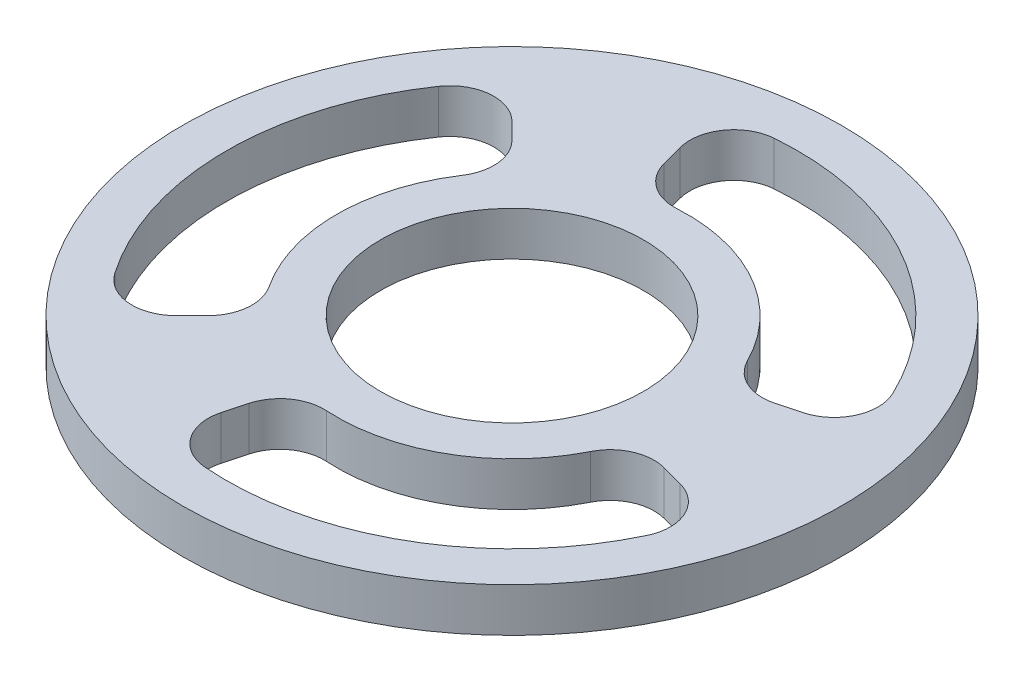
ISO-10303-21;
HEADER;
FILE_DESCRIPTION(('STEP AP214'),'2;1');
FILE_NAME('part.step','',(''),(''),'','','');
FILE_SCHEMA(('AUTOMOTIVE_DESIGN { 1 0 10303 214 1 1 1 1 }'));
ENDSEC;
DATA;
#1=APPLICATION_CONTEXT('core data for automotive mechanical design processes');
#2=APPLICATION_PROTOCOL_DEFINITION('international standard','automotive_design',2000,#1);
#3=PRODUCT_CONTEXT('',#1,'mechanical');
#4=PRODUCT('Part','Part','',(#3));
#5=PRODUCT_RELATED_PRODUCT_CATEGORY('part','',(#4));
#6=PRODUCT_DEFINITION_FORMATION('','',#4);
#7=PRODUCT_DEFINITION_CONTEXT('part definition',#1,'design');
#8=PRODUCT_DEFINITION('design','',#6,#7);
#9=PRODUCT_DEFINITION_SHAPE('','',#8);
#10=(LENGTH_UNIT() NAMED_UNIT(*) SI_UNIT(.MILLI.,.METRE.));
#11=(NAMED_UNIT(*) PLANE_ANGLE_UNIT() SI_UNIT($,.RADIAN.));
#12=(NAMED_UNIT(*) SI_UNIT($,.STERADIAN.) SOLID_ANGLE_UNIT());
#13=UNCERTAINTY_MEASURE_WITH_UNIT(LENGTH_MEASURE(1.E-05),#10,'distance_accuracy_value','');
#14=(GEOMETRIC_REPRESENTATION_CONTEXT(3) GLOBAL_UNCERTAINTY_ASSIGNED_CONTEXT((#13)) GLOBAL_UNIT_ASSIGNED_CONTEXT((#10,
#11,#12)) REPRESENTATION_CONTEXT('',''));
#15=CARTESIAN_POINT('',(0.,0.,0.));
#16=DIRECTION('',(0.,0.,1.));
#17=DIRECTION('',(1.,0.,0.));
#18=AXIS2_PLACEMENT_3D('',#15,#16,#17);
#19=CARTESIAN_POINT('',(0.,6.35,0.));
#20=DIRECTION('',(0.,1.,0.));
#21=DIRECTION('',(0.,0.,1.));
#22=AXIS2_PLACEMENT_3D('',#19,#20,#21);
#23=PLANE('',#22);
#24=DIRECTION('',(0.707106781186543,0.,-0.707106781186552));
#25=VECTOR('',#24,1.);
#26=CARTESIAN_POINT('',(-17.9251569030789,6.35,17.9251569030791));
#27=LINE('',#26,#25);
#28=CARTESIAN_POINT('',(-24.2840804334855,6.35,24.2840804334858));
#29=VERTEX_POINT('',#28);
#30=CARTESIAN_POINT('',(-21.9609596784839,6.35,21.9609596784841));
#31=VERTEX_POINT('',#30);
#32=EDGE_CURVE('E269',#29,#31,#27,.T.);
#33=ORIENTED_EDGE('',*,*,#32,.F.);
#34=CARTESIAN_POINT('',(-28.7742084940201,6.35,19.7939523729512));
#35=DIRECTION('',(0.,1.,0.));
#36=DIRECTION('',(0.866025403784436,0.,-0.500000000000004));
#37=AXIS2_PLACEMENT_3D('',#34,#35,#36);
#38=CIRCLE('',#37,6.35);
#39=CARTESIAN_POINT('',(-34.0058827656601,6.35,23.3928528043969));
#40=VERTEX_POINT('',#39);
#41=EDGE_CURVE('E215',#29,#40,#38,.F.);
#42=ORIENTED_EDGE('',*,*,#41,.T.);
#43=CARTESIAN_POINT('',(0.,6.35,0.));
#44=DIRECTION('',(0.,1.,0.));
#45=DIRECTION('',(0.866025403784436,0.,-0.500000000000004));
#46=AXIS2_PLACEMENT_3D('',#43,#44,#45);
#47=CIRCLE('',#46,41.275);
#48=CARTESIAN_POINT('',(-34.0058827656604,6.35,-23.3928528043965));
#49=VERTEX_POINT('',#48);
#50=EDGE_CURVE('E57',#49,#40,#47,.T.);
#51=ORIENTED_EDGE('',*,*,#50,.F.);
#52=CARTESIAN_POINT('',(-28.7742084940203,6.35,-19.7939523729509));
#53=DIRECTION('',(0.,1.,0.));
#54=DIRECTION('',(0.866025403784436,0.,-0.500000000000004));
#55=AXIS2_PLACEMENT_3D('',#52,#53,#54);
#56=CIRCLE('',#55,6.35);
#57=CARTESIAN_POINT('',(-24.2840804334858,6.35,-24.2840804334855));
#58=VERTEX_POINT('',#57);
#59=EDGE_CURVE('E234',#49,#58,#56,.F.);
#60=ORIENTED_EDGE('',*,*,#59,.T.);
#61=DIRECTION('',(-0.707106781186551,0.,-0.707106781186544));
#62=VECTOR('',#61,1.);
#63=CARTESIAN_POINT('',(-17.9251569030791,6.35,-17.9251569030789));
#64=LINE('',#63,#62);
#65=CARTESIAN_POINT('',(-21.9609596784841,6.35,-21.9609596784839));
#66=VERTEX_POINT('',#65);
#67=EDGE_CURVE('E243',#66,#58,#64,.T.);
#68=ORIENTED_EDGE('',*,*,#67,.F.);
#69=CARTESIAN_POINT('',(-26.4510877390187,6.35,-17.4708316179493));
#70=DIRECTION('',(0.,1.,0.));
#71=DIRECTION('',(0.866025403784436,0.,-0.500000000000004));
#72=AXIS2_PLACEMENT_3D('',#69,#70,#71);
#73=CIRCLE('',#72,6.35);
#74=CARTESIAN_POINT('',(-21.1525259994992,6.35,-13.9711539910099));
#75=VERTEX_POINT('',#74);
#76=EDGE_CURVE('E249',#66,#75,#73,.F.);
#77=ORIENTED_EDGE('',*,*,#76,.T.);
#78=CARTESIAN_POINT('',(0.,6.35,0.));
#79=DIRECTION('',(0.,-1.,0.));
#80=DIRECTION('',(0.866025403784436,0.,-0.500000000000004));
#81=AXIS2_PLACEMENT_3D('',#78,#79,#80);
#82=CIRCLE('',#81,25.35);
#83=CARTESIAN_POINT('',(-21.152525999499,6.35,13.9711539910101));
#84=VERTEX_POINT('',#83);
#85=EDGE_CURVE('E251',#84,#75,#82,.T.);
#86=ORIENTED_EDGE('',*,*,#85,.F.);
#87=CARTESIAN_POINT('',(-26.4510877390185,6.35,17.4708316179496));
#88=DIRECTION('',(0.,1.,0.));
#89=DIRECTION('',(0.866025403784436,0.,-0.500000000000004));
#90=AXIS2_PLACEMENT_3D('',#87,#88,#89);
#91=CIRCLE('',#90,6.35);
#92=EDGE_CURVE('E270',#84,#31,#91,.F.);
#93=ORIENTED_EDGE('',*,*,#92,.T.);
#94=EDGE_LOOP('',(#33,#42,#51,#60,#68,#77,#86,#93));
#95=FACE_BOUND('',#94,.T.);
#96=DIRECTION('',(-0.965925826289071,0.,-0.258819045102511));
#97=VECTOR('',#96,1.);
#98=CARTESIAN_POINT('',(24.4862196964279,6.35,6.56106279334865));
#99=LINE('',#98,#97);
#100=CARTESIAN_POINT('',(33.1726707796861,6.35,8.88859034620002));
#101=VERTEX_POINT('',#100);
#102=CARTESIAN_POINT('',(29.999228812295,6.35,8.03826913381057));
#103=VERTEX_POINT('',#102);
#104=EDGE_CURVE('E338',#101,#103,#99,.T.);
#105=ORIENTED_EDGE('',*,*,#104,.F.);
#106=CARTESIAN_POINT('',(31.5291698432851,6.35,15.0222193431356));
#107=DIRECTION('',(0.,1.,0.));
#108=DIRECTION('',(-0.866025403784443,0.,-0.499999999999992));
#109=AXIS2_PLACEMENT_3D('',#106,#107,#108);
#110=CIRCLE('',#109,6.35);
#111=CARTESIAN_POINT('',(37.2617461784279,6.35,17.7535319509785));
#112=VERTEX_POINT('',#111);
#113=EDGE_CURVE('E276',#101,#112,#110,.F.);
#114=ORIENTED_EDGE('',*,*,#113,.T.);
#115=CARTESIAN_POINT('',(0.,6.35,0.));
#116=DIRECTION('',(0.,1.,0.));
#117=DIRECTION('',(-0.866025403784443,0.,-0.499999999999992));
#118=AXIS2_PLACEMENT_3D('',#115,#116,#117);
#119=CIRCLE('',#118,41.275);
#120=CARTESIAN_POINT('',(-3.25586341276705,6.35,41.1463847553756));
#121=VERTEX_POINT('',#120);
#122=EDGE_CURVE('E64',#121,#112,#119,.T.);
#123=ORIENTED_EDGE('',*,*,#122,.F.);
#124=CARTESIAN_POINT('',(-2.75496134926442,6.35,34.816171716087));
#125=DIRECTION('',(0.,1.,0.));
#126=DIRECTION('',(-0.866025403784443,0.,-0.499999999999992));
#127=AXIS2_PLACEMENT_3D('',#124,#125,#126);
#128=CIRCLE('',#127,6.35);
#129=CARTESIAN_POINT('',(-8.88859034620003,6.35,33.1726707796861));
#130=VERTEX_POINT('',#129);
#131=EDGE_CURVE('E299',#121,#130,#128,.F.);
#132=ORIENTED_EDGE('',*,*,#131,.T.);
#133=DIRECTION('',(-0.258819045102511,0.,0.965925826289071));
#134=VECTOR('',#133,1.);
#135=CARTESIAN_POINT('',(-6.56106279334865,6.35,24.4862196964279));
#136=LINE('',#135,#134);
#137=CARTESIAN_POINT('',(-8.03826913381057,6.35,29.999228812295));
#138=VERTEX_POINT('',#137);
#139=EDGE_CURVE('E307',#138,#130,#136,.T.);
#140=ORIENTED_EDGE('',*,*,#139,.F.);
#141=CARTESIAN_POINT('',(-1.90464013687497,6.35,31.6427297486959));
#142=DIRECTION('',(0.,1.,0.));
#143=DIRECTION('',(-0.866025403784443,0.,-0.499999999999992));
#144=AXIS2_PLACEMENT_3D('',#141,#142,#143);
#145=CIRCLE('',#144,6.35);
#146=CARTESIAN_POINT('',(-1.52311127664923,6.35,25.3042018652821));
#147=VERTEX_POINT('',#146);
#148=EDGE_CURVE('E316',#138,#147,#145,.F.);
#149=ORIENTED_EDGE('',*,*,#148,.T.);
#150=CARTESIAN_POINT('',(0.,6.35,0.));
#151=DIRECTION('',(0.,-1.,0.));
#152=DIRECTION('',(-0.866025403784443,0.,-0.499999999999992));
#153=AXIS2_PLACEMENT_3D('',#150,#151,#152);
#154=CIRCLE('',#153,25.35);
#155=CARTESIAN_POINT('',(22.6756372761487,6.35,11.3330478742718));
#156=VERTEX_POINT('',#155);
#157=EDGE_CURVE('E317',#156,#147,#154,.T.);
#158=ORIENTED_EDGE('',*,*,#157,.F.);
#159=CARTESIAN_POINT('',(28.355727875894,6.35,14.1718981307462));
#160=DIRECTION('',(0.,1.,0.));
#161=DIRECTION('',(-0.866025403784443,0.,-0.499999999999992));
#162=AXIS2_PLACEMENT_3D('',#159,#160,#161);
#163=CIRCLE('',#162,6.35);
#164=EDGE_CURVE('E334',#156,#103,#163,.F.);
#165=ORIENTED_EDGE('',*,*,#164,.T.);
#166=EDGE_LOOP('',(#105,#114,#123,#132,#140,#149,#158,#165));
#167=FACE_BOUND('',#166,.T.);
#168=CARTESIAN_POINT('',(0.,6.35,0.));
#169=DIRECTION('',(0.,-1.,0.));
#170=DIRECTION('',(0.,0.,1.));
#171=AXIS2_PLACEMENT_3D('',#168,#169,#170);
#172=CIRCLE('',#171,25.35);
#173=CARTESIAN_POINT('',(-1.52311127664951,6.35,-25.304201865282));
#174=VERTEX_POINT('',#173);
#175=CARTESIAN_POINT('',(22.6756372761486,6.35,-11.333047874272));
#176=VERTEX_POINT('',#175);
#177=EDGE_CURVE('E274',#174,#176,#172,.T.);
#178=ORIENTED_EDGE('',*,*,#177,.F.);
#179=CARTESIAN_POINT('',(-1.90464013687533,6.35,-31.6427297486959));
#180=DIRECTION('',(0.,1.,0.));
#181=DIRECTION('',(0.,0.,1.));
#182=AXIS2_PLACEMENT_3D('',#179,#180,#181);
#183=CIRCLE('',#182,6.35);
#184=CARTESIAN_POINT('',(-8.03826913381091,6.35,-29.9992288122949));
#185=VERTEX_POINT('',#184);
#186=EDGE_CURVE('E396',#174,#185,#183,.F.);
#187=ORIENTED_EDGE('',*,*,#186,.T.);
#188=DIRECTION('',(0.258819045102522,0.,0.965925826289068));
#189=VECTOR('',#188,1.);
#190=CARTESIAN_POINT('',(-6.56106279334892,6.35,-24.4862196964279));
#191=LINE('',#190,#189);
#192=CARTESIAN_POINT('',(-8.8885903462004,6.35,-33.172670779686));
#193=VERTEX_POINT('',#192);
#194=EDGE_CURVE('E341',#193,#185,#191,.T.);
#195=ORIENTED_EDGE('',*,*,#194,.F.);
#196=CARTESIAN_POINT('',(-2.75496134926482,6.35,-34.816171716087));
#197=DIRECTION('',(0.,1.,0.));
#198=DIRECTION('',(0.,0.,1.));
#199=AXIS2_PLACEMENT_3D('',#196,#197,#198);
#200=CIRCLE('',#199,6.35);
#201=CARTESIAN_POINT('',(-3.25586341276751,6.35,-41.1463847553756));
#202=VERTEX_POINT('',#201);
#203=EDGE_CURVE('E47',#193,#202,#200,.F.);
#204=ORIENTED_EDGE('',*,*,#203,.T.);
#205=CARTESIAN_POINT('',(0.,6.35,0.));
#206=DIRECTION('',(0.,1.,0.));
#207=DIRECTION('',(0.,0.,1.));
#208=AXIS2_PLACEMENT_3D('',#205,#206,#207);
#209=CIRCLE('',#208,41.275);
#210=CARTESIAN_POINT('',(37.2617461784277,6.35,-17.7535319509789));
#211=VERTEX_POINT('',#210);
#212=EDGE_CURVE('E359',#211,#202,#209,.T.);
#213=ORIENTED_EDGE('',*,*,#212,.F.);
#214=CARTESIAN_POINT('',(31.529169843285,6.35,-15.022219343136));
#215=DIRECTION('',(0.,1.,0.));
#216=DIRECTION('',(0.,0.,1.));
#217=AXIS2_PLACEMENT_3D('',#214,#215,#216);
#218=CIRCLE('',#217,6.35);
#219=CARTESIAN_POINT('',(33.172670779686,6.35,-8.8885903462004));
#220=VERTEX_POINT('',#219);
#221=EDGE_CURVE('E404',#211,#220,#218,.F.);
#222=ORIENTED_EDGE('',*,*,#221,.T.);
#223=DIRECTION('',(0.965925826289068,0.,-0.258819045102521));
#224=VECTOR('',#223,1.);
#225=CARTESIAN_POINT('',(24.4862196964279,6.35,-6.56106279334893));
#226=LINE('',#225,#224);
#227=CARTESIAN_POINT('',(29.9992288122949,6.35,-8.03826913381091));
#228=VERTEX_POINT('',#227);
#229=EDGE_CURVE('E360',#228,#220,#226,.T.);
#230=ORIENTED_EDGE('',*,*,#229,.F.);
#231=CARTESIAN_POINT('',(28.3557278758939,6.35,-14.1718981307465));
#232=DIRECTION('',(0.,1.,0.));
#233=DIRECTION('',(0.,0.,1.));
#234=AXIS2_PLACEMENT_3D('',#231,#232,#233);
#235=CIRCLE('',#234,6.35);
#236=EDGE_CURVE('E397',#228,#176,#235,.F.);
#237=ORIENTED_EDGE('',*,*,#236,.T.);
#238=EDGE_LOOP('',(#178,#187,#195,#204,#213,#222,#230,#237));
#239=FACE_BOUND('',#238,.T.);
#240=CARTESIAN_POINT('',(0.,6.35,0.));
#241=DIRECTION('',(0.,1.,0.));
#242=DIRECTION('',(0.,0.,1.));
#243=AXIS2_PLACEMENT_3D('',#240,#241,#242);
#244=CIRCLE('',#243,47.625);
#245=CARTESIAN_POINT('',(0.,6.35,47.625));
#246=VERTEX_POINT('',#245);
#247=EDGE_CURVE('E371',#246,#246,#244,.T.);
#248=ORIENTED_EDGE('',*,*,#247,.T.);
#249=EDGE_LOOP('',(#248));
#250=FACE_BOUND('',#249,.T.);
#251=CARTESIAN_POINT('',(0.,6.35,0.));
#252=DIRECTION('',(0.,1.,0.));
#253=DIRECTION('',(0.,0.,1.));
#254=AXIS2_PLACEMENT_3D('',#251,#252,#253);
#255=CIRCLE('',#254,19.);
#256=CARTESIAN_POINT('',(0.,6.35,19.));
#257=VERTEX_POINT('',#256);
#258=EDGE_CURVE('E364',#257,#257,#255,.T.);
#259=ORIENTED_EDGE('',*,*,#258,.F.);
#260=EDGE_LOOP('',(#259));
#261=FACE_BOUND('',#260,.T.);
#262=ADVANCED_FACE('F41',(#95,#167,#239,#250,#261),#23,.T.);
#263=CARTESIAN_POINT('',(0.,0.,0.));
#264=DIRECTION('',(0.,1.,0.));
#265=DIRECTION('',(0.,0.,1.));
#266=AXIS2_PLACEMENT_3D('',#263,#264,#265);
#267=PLANE('',#266);
#268=CARTESIAN_POINT('',(-28.7742084940201,0.,19.7939523729512));
#269=DIRECTION('',(0.,1.,0.));
#270=DIRECTION('',(0.866025403784436,0.,-0.500000000000004));
#271=AXIS2_PLACEMENT_3D('',#268,#269,#270);
#272=CIRCLE('',#271,6.35);
#273=CARTESIAN_POINT('',(-34.0058827656601,0.,23.3928528043969));
#274=VERTEX_POINT('',#273);
#275=CARTESIAN_POINT('',(-24.2840804334855,0.,24.2840804334858));
#276=VERTEX_POINT('',#275);
#277=EDGE_CURVE('E201',#274,#276,#272,.T.);
#278=ORIENTED_EDGE('',*,*,#277,.T.);
#279=DIRECTION('',(0.707106781186543,0.,-0.707106781186552));
#280=VECTOR('',#279,1.);
#281=CARTESIAN_POINT('',(-17.9251569030789,0.,17.9251569030791));
#282=LINE('',#281,#280);
#283=CARTESIAN_POINT('',(-21.9609596784839,0.,21.9609596784841));
#284=VERTEX_POINT('',#283);
#285=EDGE_CURVE('E272',#276,#284,#282,.T.);
#286=ORIENTED_EDGE('',*,*,#285,.T.);
#287=CARTESIAN_POINT('',(-26.4510877390185,0.,17.4708316179496));
#288=DIRECTION('',(0.,1.,0.));
#289=DIRECTION('',(0.866025403784436,0.,-0.500000000000004));
#290=AXIS2_PLACEMENT_3D('',#287,#288,#289);
#291=CIRCLE('',#290,6.35);
#292=CARTESIAN_POINT('',(-21.152525999499,0.,13.9711539910101));
#293=VERTEX_POINT('',#292);
#294=EDGE_CURVE('E261',#284,#293,#291,.T.);
#295=ORIENTED_EDGE('',*,*,#294,.T.);
#296=CARTESIAN_POINT('',(0.,0.,0.));
#297=DIRECTION('',(0.,-1.,0.));
#298=DIRECTION('',(0.866025403784436,0.,-0.500000000000004));
#299=AXIS2_PLACEMENT_3D('',#296,#297,#298);
#300=CIRCLE('',#299,25.35);
#301=CARTESIAN_POINT('',(-21.1525259994992,0.,-13.9711539910099));
#302=VERTEX_POINT('',#301);
#303=EDGE_CURVE('E258',#293,#302,#300,.T.);
#304=ORIENTED_EDGE('',*,*,#303,.T.);
#305=CARTESIAN_POINT('',(-26.4510877390187,0.,-17.4708316179493));
#306=DIRECTION('',(0.,1.,0.));
#307=DIRECTION('',(0.866025403784436,0.,-0.500000000000004));
#308=AXIS2_PLACEMENT_3D('',#305,#306,#307);
#309=CIRCLE('',#308,6.35);
#310=CARTESIAN_POINT('',(-21.9609596784841,0.,-21.9609596784839));
#311=VERTEX_POINT('',#310);
#312=EDGE_CURVE('E244',#302,#311,#309,.T.);
#313=ORIENTED_EDGE('',*,*,#312,.T.);
#314=DIRECTION('',(-0.707106781186551,0.,-0.707106781186544));
#315=VECTOR('',#314,1.);
#316=CARTESIAN_POINT('',(-17.9251569030791,0.,-17.9251569030789));
#317=LINE('',#316,#315);
#318=CARTESIAN_POINT('',(-24.2840804334858,0.,-24.2840804334855));
#319=VERTEX_POINT('',#318);
#320=EDGE_CURVE('E240',#311,#319,#317,.T.);
#321=ORIENTED_EDGE('',*,*,#320,.T.);
#322=CARTESIAN_POINT('',(-28.7742084940203,0.,-19.7939523729509));
#323=DIRECTION('',(0.,1.,0.));
#324=DIRECTION('',(0.866025403784436,0.,-0.500000000000004));
#325=AXIS2_PLACEMENT_3D('',#322,#323,#324);
#326=CIRCLE('',#325,6.35);
#327=CARTESIAN_POINT('',(-34.0058827656604,0.,-23.3928528043965));
#328=VERTEX_POINT('',#327);
#329=EDGE_CURVE('E224',#319,#328,#326,.T.);
#330=ORIENTED_EDGE('',*,*,#329,.T.);
#331=CARTESIAN_POINT('',(0.,0.,0.));
#332=DIRECTION('',(0.,1.,0.));
#333=DIRECTION('',(0.866025403784436,0.,-0.500000000000004));
#334=AXIS2_PLACEMENT_3D('',#331,#332,#333);
#335=CIRCLE('',#334,41.275);
#336=EDGE_CURVE('E216',#328,#274,#335,.T.);
#337=ORIENTED_EDGE('',*,*,#336,.T.);
#338=EDGE_LOOP('',(#278,#286,#295,#304,#313,#321,#330,#337));
#339=FACE_BOUND('',#338,.T.);
#340=CARTESIAN_POINT('',(31.5291698432851,0.,15.0222193431356));
#341=DIRECTION('',(0.,1.,0.));
#342=DIRECTION('',(-0.866025403784443,0.,-0.499999999999992));
#343=AXIS2_PLACEMENT_3D('',#340,#341,#342);
#344=CIRCLE('',#343,6.35);
#345=CARTESIAN_POINT('',(37.2617461784279,0.,17.7535319509785));
#346=VERTEX_POINT('',#345);
#347=CARTESIAN_POINT('',(33.1726707796861,0.,8.88859034620002));
#348=VERTEX_POINT('',#347);
#349=EDGE_CURVE('E277',#346,#348,#344,.T.);
#350=ORIENTED_EDGE('',*,*,#349,.T.);
#351=DIRECTION('',(-0.965925826289071,0.,-0.258819045102511));
#352=VECTOR('',#351,1.);
#353=CARTESIAN_POINT('',(24.4862196964279,0.,6.56106279334865));
#354=LINE('',#353,#352);
#355=CARTESIAN_POINT('',(29.999228812295,0.,8.03826913381057));
#356=VERTEX_POINT('',#355);
#357=EDGE_CURVE('E213',#348,#356,#354,.T.);
#358=ORIENTED_EDGE('',*,*,#357,.T.);
#359=CARTESIAN_POINT('',(28.355727875894,0.,14.1718981307462));
#360=DIRECTION('',(0.,1.,0.));
#361=DIRECTION('',(-0.866025403784443,0.,-0.499999999999992));
#362=AXIS2_PLACEMENT_3D('',#359,#360,#361);
#363=CIRCLE('',#362,6.35);
#364=CARTESIAN_POINT('',(22.6756372761487,0.,11.3330478742718));
#365=VERTEX_POINT('',#364);
#366=EDGE_CURVE('E330',#356,#365,#363,.T.);
#367=ORIENTED_EDGE('',*,*,#366,.T.);
#368=CARTESIAN_POINT('',(0.,0.,0.));
#369=DIRECTION('',(0.,-1.,0.));
#370=DIRECTION('',(-0.866025403784443,0.,-0.499999999999992));
#371=AXIS2_PLACEMENT_3D('',#368,#369,#370);
#372=CIRCLE('',#371,25.35);
#373=CARTESIAN_POINT('',(-1.52311127664923,0.,25.3042018652821));
#374=VERTEX_POINT('',#373);
#375=EDGE_CURVE('E325',#365,#374,#372,.T.);
#376=ORIENTED_EDGE('',*,*,#375,.T.);
#377=CARTESIAN_POINT('',(-1.90464013687497,0.,31.6427297486959));
#378=DIRECTION('',(0.,1.,0.));
#379=DIRECTION('',(-0.866025403784443,0.,-0.499999999999992));
#380=AXIS2_PLACEMENT_3D('',#377,#378,#379);
#381=CIRCLE('',#380,6.35);
#382=CARTESIAN_POINT('',(-8.03826913381057,0.,29.999228812295));
#383=VERTEX_POINT('',#382);
#384=EDGE_CURVE('E309',#374,#383,#381,.T.);
#385=ORIENTED_EDGE('',*,*,#384,.T.);
#386=DIRECTION('',(-0.258819045102511,0.,0.965925826289071));
#387=VECTOR('',#386,1.);
#388=CARTESIAN_POINT('',(-6.56106279334865,0.,24.4862196964279));
#389=LINE('',#388,#387);
#390=CARTESIAN_POINT('',(-8.88859034620003,0.,33.1726707796861));
#391=VERTEX_POINT('',#390);
#392=EDGE_CURVE('E305',#383,#391,#389,.T.);
#393=ORIENTED_EDGE('',*,*,#392,.T.);
#394=CARTESIAN_POINT('',(-2.75496134926442,0.,34.816171716087));
#395=DIRECTION('',(0.,1.,0.));
#396=DIRECTION('',(-0.866025403784443,0.,-0.499999999999992));
#397=AXIS2_PLACEMENT_3D('',#394,#395,#396);
#398=CIRCLE('',#397,6.35);
#399=CARTESIAN_POINT('',(-3.25586341276705,0.,41.1463847553756));
#400=VERTEX_POINT('',#399);
#401=EDGE_CURVE('E291',#391,#400,#398,.T.);
#402=ORIENTED_EDGE('',*,*,#401,.T.);
#403=CARTESIAN_POINT('',(0.,0.,0.));
#404=DIRECTION('',(0.,1.,0.));
#405=DIRECTION('',(-0.866025403784443,0.,-0.499999999999992));
#406=AXIS2_PLACEMENT_3D('',#403,#404,#405);
#407=CIRCLE('',#406,41.275);
#408=EDGE_CURVE('E290',#400,#346,#407,.T.);
#409=ORIENTED_EDGE('',*,*,#408,.T.);
#410=EDGE_LOOP('',(#350,#358,#367,#376,#385,#393,#402,#409));
#411=FACE_BOUND('',#410,.T.);
#412=CARTESIAN_POINT('',(0.,0.,0.));
#413=DIRECTION('',(0.,1.,0.));
#414=DIRECTION('',(0.,0.,1.));
#415=AXIS2_PLACEMENT_3D('',#412,#413,#414);
#416=CIRCLE('',#415,41.275);
#417=CARTESIAN_POINT('',(37.2617461784277,0.,-17.7535319509789));
#418=VERTEX_POINT('',#417);
#419=CARTESIAN_POINT('',(-3.25586341276751,0.,-41.1463847553756));
#420=VERTEX_POINT('',#419);
#421=EDGE_CURVE('E346',#418,#420,#416,.T.);
#422=ORIENTED_EDGE('',*,*,#421,.T.);
#423=CARTESIAN_POINT('',(-2.75496134926482,0.,-34.816171716087));
#424=DIRECTION('',(0.,1.,0.));
#425=DIRECTION('',(0.,0.,1.));
#426=AXIS2_PLACEMENT_3D('',#423,#424,#425);
#427=CIRCLE('',#426,6.35);
#428=CARTESIAN_POINT('',(-8.8885903462004,0.,-33.172670779686));
#429=VERTEX_POINT('',#428);
#430=EDGE_CURVE('E11',#420,#429,#427,.T.);
#431=ORIENTED_EDGE('',*,*,#430,.T.);
#432=DIRECTION('',(0.258819045102522,0.,0.965925826289068));
#433=VECTOR('',#432,1.);
#434=CARTESIAN_POINT('',(-6.56106279334892,0.,-24.4862196964279));
#435=LINE('',#434,#433);
#436=CARTESIAN_POINT('',(-8.03826913381091,0.,-29.9992288122949));
#437=VERTEX_POINT('',#436);
#438=EDGE_CURVE('E353',#429,#437,#435,.T.);
#439=ORIENTED_EDGE('',*,*,#438,.T.);
#440=CARTESIAN_POINT('',(-1.90464013687533,0.,-31.6427297486959));
#441=DIRECTION('',(0.,1.,0.));
#442=DIRECTION('',(0.,0.,1.));
#443=AXIS2_PLACEMENT_3D('',#440,#441,#442);
#444=CIRCLE('',#443,6.35);
#445=CARTESIAN_POINT('',(-1.52311127664951,0.,-25.304201865282));
#446=VERTEX_POINT('',#445);
#447=EDGE_CURVE('E405',#437,#446,#444,.T.);
#448=ORIENTED_EDGE('',*,*,#447,.T.);
#449=CARTESIAN_POINT('',(0.,0.,0.));
#450=DIRECTION('',(0.,-1.,0.));
#451=DIRECTION('',(0.,0.,1.));
#452=AXIS2_PLACEMENT_3D('',#449,#450,#451);
#453=CIRCLE('',#452,25.35);
#454=CARTESIAN_POINT('',(22.6756372761486,0.,-11.333047874272));
#455=VERTEX_POINT('',#454);
#456=EDGE_CURVE('E342',#446,#455,#453,.T.);
#457=ORIENTED_EDGE('',*,*,#456,.T.);
#458=CARTESIAN_POINT('',(28.3557278758939,0.,-14.1718981307465));
#459=DIRECTION('',(0.,1.,0.));
#460=DIRECTION('',(0.,0.,1.));
#461=AXIS2_PLACEMENT_3D('',#458,#459,#460);
#462=CIRCLE('',#461,6.35);
#463=CARTESIAN_POINT('',(29.9992288122949,0.,-8.03826913381091));
#464=VERTEX_POINT('',#463);
#465=EDGE_CURVE('E398',#455,#464,#462,.T.);
#466=ORIENTED_EDGE('',*,*,#465,.T.);
#467=DIRECTION('',(0.965925826289068,0.,-0.258819045102521));
#468=VECTOR('',#467,1.);
#469=CARTESIAN_POINT('',(24.4862196964279,0.,-6.56106279334893));
#470=LINE('',#469,#468);
#471=CARTESIAN_POINT('',(33.172670779686,0.,-8.8885903462004));
#472=VERTEX_POINT('',#471);
#473=EDGE_CURVE('E344',#464,#472,#470,.T.);
#474=ORIENTED_EDGE('',*,*,#473,.T.);
#475=CARTESIAN_POINT('',(31.529169843285,0.,-15.022219343136));
#476=DIRECTION('',(0.,1.,0.));
#477=DIRECTION('',(0.,0.,1.));
#478=AXIS2_PLACEMENT_3D('',#475,#476,#477);
#479=CIRCLE('',#478,6.35);
#480=EDGE_CURVE('E408',#472,#418,#479,.T.);
#481=ORIENTED_EDGE('',*,*,#480,.T.);
#482=EDGE_LOOP('',(#422,#431,#439,#448,#457,#466,#474,#481));
#483=FACE_BOUND('',#482,.T.);
#484=CARTESIAN_POINT('',(0.,0.,0.));
#485=DIRECTION('',(0.,1.,0.));
#486=DIRECTION('',(0.,0.,1.));
#487=AXIS2_PLACEMENT_3D('',#484,#485,#486);
#488=CIRCLE('',#487,47.625);
#489=CARTESIAN_POINT('',(0.,0.,47.625));
#490=VERTEX_POINT('',#489);
#491=EDGE_CURVE('E366',#490,#490,#488,.T.);
#492=ORIENTED_EDGE('',*,*,#491,.F.);
#493=EDGE_LOOP('',(#492));
#494=FACE_BOUND('',#493,.T.);
#495=CARTESIAN_POINT('',(0.,0.,0.));
#496=DIRECTION('',(0.,1.,0.));
#497=DIRECTION('',(0.,0.,1.));
#498=AXIS2_PLACEMENT_3D('',#495,#496,#497);
#499=CIRCLE('',#498,19.);
#500=CARTESIAN_POINT('',(0.,0.,19.));
#501=VERTEX_POINT('',#500);
#502=EDGE_CURVE('E354',#501,#501,#499,.T.);
#503=ORIENTED_EDGE('',*,*,#502,.T.);
#504=EDGE_LOOP('',(#503));
#505=FACE_BOUND('',#504,.T.);
#506=ADVANCED_FACE('F219',(#339,#411,#483,#494,#505),#267,.F.);
#507=CARTESIAN_POINT('',(0.,6.35,0.));
#508=DIRECTION('',(0.,-1.,0.));
#509=DIRECTION('',(0.,0.,-1.));
#510=AXIS2_PLACEMENT_3D('',#507,#508,#509);
#511=CYLINDRICAL_SURFACE('',#510,47.625);
#512=ORIENTED_EDGE('',*,*,#247,.F.);
#513=EDGE_LOOP('',(#512));
#514=FACE_BOUND('',#513,.T.);
#515=ORIENTED_EDGE('',*,*,#491,.T.);
#516=EDGE_LOOP('',(#515));
#517=FACE_BOUND('',#516,.T.);
#518=ADVANCED_FACE('F459',(#514,#517),#511,.T.);
#519=CARTESIAN_POINT('',(0.,6.35,0.));
#520=DIRECTION('',(0.,-1.,0.));
#521=DIRECTION('',(0.,0.,-1.));
#522=AXIS2_PLACEMENT_3D('',#519,#520,#521);
#523=CYLINDRICAL_SURFACE('',#522,19.);
#524=ORIENTED_EDGE('',*,*,#258,.T.);
#525=EDGE_LOOP('',(#524));
#526=FACE_BOUND('',#525,.T.);
#527=ORIENTED_EDGE('',*,*,#502,.F.);
#528=EDGE_LOOP('',(#527));
#529=FACE_BOUND('',#528,.T.);
#530=ADVANCED_FACE('F464',(#526,#529),#523,.F.);
#531=CARTESIAN_POINT('',(0.,0.,0.));
#532=DIRECTION('',(0.,1.,0.));
#533=DIRECTION('',(0.,0.,1.));
#534=AXIS2_PLACEMENT_3D('',#531,#532,#533);
#535=CYLINDRICAL_SURFACE('',#534,25.35);
#536=ORIENTED_EDGE('',*,*,#177,.T.);
#537=DIRECTION('',(0.,1.,0.));
#538=VECTOR('',#537,1.);
#539=CARTESIAN_POINT('',(22.6756372761486,0.,-11.333047874272));
#540=LINE('',#539,#538);
#541=EDGE_CURVE('E383',#176,#455,#540,.F.);
#542=ORIENTED_EDGE('',*,*,#541,.T.);
#543=ORIENTED_EDGE('',*,*,#456,.F.);
#544=DIRECTION('',(0.,1.,0.));
#545=VECTOR('',#544,1.);
#546=CARTESIAN_POINT('',(-1.52311127664951,0.,-25.304201865282));
#547=LINE('',#546,#545);
#548=EDGE_CURVE('E381',#446,#174,#547,.T.);
#549=ORIENTED_EDGE('',*,*,#548,.T.);
#550=EDGE_LOOP('',(#536,#542,#543,#549));
#551=FACE_BOUND('',#550,.T.);
#552=ADVANCED_FACE('F433',(#551),#535,.T.);
#553=CARTESIAN_POINT('',(-6.56106279334892,0.,-24.4862196964279));
#554=DIRECTION('',(-0.965925826289068,0.,0.258819045102522));
#555=DIRECTION('',(0.258819045102522,0.,0.965925826289068));
#556=AXIS2_PLACEMENT_3D('',#553,#554,#555);
#557=PLANE('',#556);
#558=ORIENTED_EDGE('',*,*,#194,.T.);
#559=DIRECTION('',(0.,-1.,0.));
#560=VECTOR('',#559,1.);
#561=CARTESIAN_POINT('',(-8.03826913381091,0.,-29.9992288122949));
#562=LINE('',#561,#560);
#563=EDGE_CURVE('E386',#185,#437,#562,.T.);
#564=ORIENTED_EDGE('',*,*,#563,.T.);
#565=ORIENTED_EDGE('',*,*,#438,.F.);
#566=DIRECTION('',(0.,-1.,0.));
#567=VECTOR('',#566,1.);
#568=CARTESIAN_POINT('',(-8.8885903462004,6.35,-33.172670779686));
#569=LINE('',#568,#567);
#570=EDGE_CURVE('E387',#429,#193,#569,.F.);
#571=ORIENTED_EDGE('',*,*,#570,.T.);
#572=EDGE_LOOP('',(#558,#564,#565,#571));
#573=FACE_BOUND('',#572,.T.);
#574=ADVANCED_FACE('F422',(#573),#557,.F.);
#575=CARTESIAN_POINT('',(0.,0.,0.));
#576=DIRECTION('',(0.,1.,0.));
#577=DIRECTION('',(0.,0.,1.));
#578=AXIS2_PLACEMENT_3D('',#575,#576,#577);
#579=CYLINDRICAL_SURFACE('',#578,41.275);
#580=ORIENTED_EDGE('',*,*,#421,.F.);
#581=DIRECTION('',(0.,1.,0.));
#582=VECTOR('',#581,1.);
#583=CARTESIAN_POINT('',(37.2617461784277,0.,-17.7535319509789));
#584=LINE('',#583,#582);
#585=EDGE_CURVE('E391',#418,#211,#584,.T.);
#586=ORIENTED_EDGE('',*,*,#585,.T.);
#587=ORIENTED_EDGE('',*,*,#212,.T.);
#588=DIRECTION('',(0.,1.,0.));
#589=VECTOR('',#588,1.);
#590=CARTESIAN_POINT('',(-3.25586341276751,0.,-41.1463847553756));
#591=LINE('',#590,#589);
#592=EDGE_CURVE('E393',#202,#420,#591,.F.);
#593=ORIENTED_EDGE('',*,*,#592,.T.);
#594=EDGE_LOOP('',(#580,#586,#587,#593));
#595=FACE_BOUND('',#594,.T.);
#596=ADVANCED_FACE('F417',(#595),#579,.F.);
#597=CARTESIAN_POINT('',(24.4862196964279,0.,-6.56106279334893));
#598=DIRECTION('',(0.258819045102522,0.,0.965925826289068));
#599=DIRECTION('',(0.965925826289068,0.,-0.258819045102522));
#600=AXIS2_PLACEMENT_3D('',#597,#598,#599);
#601=PLANE('',#600);
#602=ORIENTED_EDGE('',*,*,#473,.F.);
#603=DIRECTION('',(0.,-1.,0.));
#604=VECTOR('',#603,1.);
#605=CARTESIAN_POINT('',(29.9992288122949,6.35,-8.03826913381091));
#606=LINE('',#605,#604);
#607=EDGE_CURVE('E378',#464,#228,#606,.F.);
#608=ORIENTED_EDGE('',*,*,#607,.T.);
#609=ORIENTED_EDGE('',*,*,#229,.T.);
#610=DIRECTION('',(0.,-1.,0.));
#611=VECTOR('',#610,1.);
#612=CARTESIAN_POINT('',(33.172670779686,0.,-8.8885903462004));
#613=LINE('',#612,#611);
#614=EDGE_CURVE('E372',#220,#472,#613,.T.);
#615=ORIENTED_EDGE('',*,*,#614,.T.);
#616=EDGE_LOOP('',(#602,#608,#609,#615));
#617=FACE_BOUND('',#616,.T.);
#618=ADVANCED_FACE('F442',(#617),#601,.F.);
#619=CARTESIAN_POINT('',(28.3557278758939,0.,-14.1718981307465));
#620=DIRECTION('',(0.,1.,0.));
#621=DIRECTION('',(0.,0.,1.));
#622=AXIS2_PLACEMENT_3D('',#619,#620,#621);
#623=CYLINDRICAL_SURFACE('',#622,6.35);
#624=ORIENTED_EDGE('',*,*,#465,.F.);
#625=ORIENTED_EDGE('',*,*,#541,.F.);
#626=ORIENTED_EDGE('',*,*,#236,.F.);
#627=ORIENTED_EDGE('',*,*,#607,.F.);
#628=EDGE_LOOP('',(#624,#625,#626,#627));
#629=FACE_BOUND('',#628,.T.);
#630=ADVANCED_FACE('F436',(#629),#623,.F.);
#631=CARTESIAN_POINT('',(-1.90464013687533,0.,-31.6427297486959));
#632=DIRECTION('',(0.,1.,0.));
#633=DIRECTION('',(0.,0.,1.));
#634=AXIS2_PLACEMENT_3D('',#631,#632,#633);
#635=CYLINDRICAL_SURFACE('',#634,6.35);
#636=ORIENTED_EDGE('',*,*,#447,.F.);
#637=ORIENTED_EDGE('',*,*,#563,.F.);
#638=ORIENTED_EDGE('',*,*,#186,.F.);
#639=ORIENTED_EDGE('',*,*,#548,.F.);
#640=EDGE_LOOP('',(#636,#637,#638,#639));
#641=FACE_BOUND('',#640,.T.);
#642=ADVANCED_FACE('F428',(#641),#635,.F.);
#643=CARTESIAN_POINT('',(31.529169843285,0.,-15.022219343136));
#644=DIRECTION('',(0.,1.,0.));
#645=DIRECTION('',(0.,0.,1.));
#646=AXIS2_PLACEMENT_3D('',#643,#644,#645);
#647=CYLINDRICAL_SURFACE('',#646,6.35);
#648=ORIENTED_EDGE('',*,*,#480,.F.);
#649=ORIENTED_EDGE('',*,*,#614,.F.);
#650=ORIENTED_EDGE('',*,*,#221,.F.);
#651=ORIENTED_EDGE('',*,*,#585,.F.);
#652=EDGE_LOOP('',(#648,#649,#650,#651));
#653=FACE_BOUND('',#652,.T.);
#654=ADVANCED_FACE('F443',(#653),#647,.F.);
#655=CARTESIAN_POINT('',(-2.75496134926482,0.,-34.816171716087));
#656=DIRECTION('',(0.,1.,0.));
#657=DIRECTION('',(0.,0.,1.));
#658=AXIS2_PLACEMENT_3D('',#655,#656,#657);
#659=CYLINDRICAL_SURFACE('',#658,6.35);
#660=ORIENTED_EDGE('',*,*,#430,.F.);
#661=ORIENTED_EDGE('',*,*,#592,.F.);
#662=ORIENTED_EDGE('',*,*,#203,.F.);
#663=ORIENTED_EDGE('',*,*,#570,.F.);
#664=EDGE_LOOP('',(#660,#661,#662,#663));
#665=FACE_BOUND('',#664,.T.);
#666=ADVANCED_FACE('F43',(#665),#659,.F.);
#667=CARTESIAN_POINT('',(24.4862196964279,0.,6.56106279334865));
#668=DIRECTION('',(0.258819045102511,0.,-0.965925826289071));
#669=DIRECTION('',(-0.965925826289071,0.,-0.258819045102511));
#670=AXIS2_PLACEMENT_3D('',#667,#668,#669);
#671=PLANE('',#670);
#672=ORIENTED_EDGE('',*,*,#104,.T.);
#673=DIRECTION('',(0.,-1.,0.));
#674=VECTOR('',#673,1.);
#675=CARTESIAN_POINT('',(29.999228812295,0.,8.03826913381057));
#676=LINE('',#675,#674);
#677=EDGE_CURVE('E329',#103,#356,#676,.T.);
#678=ORIENTED_EDGE('',*,*,#677,.T.);
#679=ORIENTED_EDGE('',*,*,#357,.F.);
#680=DIRECTION('',(0.,-1.,0.));
#681=VECTOR('',#680,1.);
#682=CARTESIAN_POINT('',(33.1726707796861,6.35,8.88859034620003));
#683=LINE('',#682,#681);
#684=EDGE_CURVE('E284',#348,#101,#683,.F.);
#685=ORIENTED_EDGE('',*,*,#684,.T.);
#686=EDGE_LOOP('',(#672,#678,#679,#685));
#687=FACE_BOUND('',#686,.T.);
#688=ADVANCED_FACE('F452',(#687),#671,.F.);
#689=CARTESIAN_POINT('',(28.355727875894,0.,14.1718981307462));
#690=DIRECTION('',(0.,1.,0.));
#691=DIRECTION('',(-0.866025403784443,0.,-0.499999999999992));
#692=AXIS2_PLACEMENT_3D('',#689,#690,#691);
#693=CYLINDRICAL_SURFACE('',#692,6.35);
#694=ORIENTED_EDGE('',*,*,#366,.F.);
#695=ORIENTED_EDGE('',*,*,#677,.F.);
#696=ORIENTED_EDGE('',*,*,#164,.F.);
#697=DIRECTION('',(0.,1.,0.));
#698=VECTOR('',#697,1.);
#699=CARTESIAN_POINT('',(22.6756372761487,0.,11.3330478742718));
#700=LINE('',#699,#698);
#701=EDGE_CURVE('E324',#365,#156,#700,.T.);
#702=ORIENTED_EDGE('',*,*,#701,.F.);
#703=EDGE_LOOP('',(#694,#695,#696,#702));
#704=FACE_BOUND('',#703,.T.);
#705=ADVANCED_FACE('F518',(#704),#693,.F.);
#706=CARTESIAN_POINT('',(0.,0.,0.));
#707=DIRECTION('',(0.,1.,0.));
#708=DIRECTION('',(-0.866025403784443,0.,-0.499999999999992));
#709=AXIS2_PLACEMENT_3D('',#706,#707,#708);
#710=CYLINDRICAL_SURFACE('',#709,25.35);
#711=ORIENTED_EDGE('',*,*,#157,.T.);
#712=DIRECTION('',(0.,1.,0.));
#713=VECTOR('',#712,1.);
#714=CARTESIAN_POINT('',(-1.52311127664923,0.,25.3042018652821));
#715=LINE('',#714,#713);
#716=EDGE_CURVE('E311',#147,#374,#715,.F.);
#717=ORIENTED_EDGE('',*,*,#716,.T.);
#718=ORIENTED_EDGE('',*,*,#375,.F.);
#719=ORIENTED_EDGE('',*,*,#701,.T.);
#720=EDGE_LOOP('',(#711,#717,#718,#719));
#721=FACE_BOUND('',#720,.T.);
#722=ADVANCED_FACE('F528',(#721),#710,.T.);
#723=CARTESIAN_POINT('',(-1.90464013687497,0.,31.6427297486959));
#724=DIRECTION('',(0.,1.,0.));
#725=DIRECTION('',(-0.866025403784443,0.,-0.499999999999992));
#726=AXIS2_PLACEMENT_3D('',#723,#724,#725);
#727=CYLINDRICAL_SURFACE('',#726,6.35);
#728=ORIENTED_EDGE('',*,*,#384,.F.);
#729=ORIENTED_EDGE('',*,*,#716,.F.);
#730=ORIENTED_EDGE('',*,*,#148,.F.);
#731=DIRECTION('',(0.,-1.,0.));
#732=VECTOR('',#731,1.);
#733=CARTESIAN_POINT('',(-8.03826913381057,6.35,29.999228812295));
#734=LINE('',#733,#732);
#735=EDGE_CURVE('E304',#383,#138,#734,.F.);
#736=ORIENTED_EDGE('',*,*,#735,.F.);
#737=EDGE_LOOP('',(#728,#729,#730,#736));
#738=FACE_BOUND('',#737,.T.);
#739=ADVANCED_FACE('F532',(#738),#727,.F.);
#740=CARTESIAN_POINT('',(-6.56106279334865,0.,24.4862196964279));
#741=DIRECTION('',(-0.965925826289071,0.,-0.258819045102511));
#742=DIRECTION('',(-0.258819045102511,0.,0.965925826289071));
#743=AXIS2_PLACEMENT_3D('',#740,#741,#742);
#744=PLANE('',#743);
#745=ORIENTED_EDGE('',*,*,#392,.F.);
#746=ORIENTED_EDGE('',*,*,#735,.T.);
#747=ORIENTED_EDGE('',*,*,#139,.T.);
#748=DIRECTION('',(0.,-1.,0.));
#749=VECTOR('',#748,1.);
#750=CARTESIAN_POINT('',(-8.88859034620003,0.,33.1726707796861));
#751=LINE('',#750,#749);
#752=EDGE_CURVE('E298',#130,#391,#751,.T.);
#753=ORIENTED_EDGE('',*,*,#752,.T.);
#754=EDGE_LOOP('',(#745,#746,#747,#753));
#755=FACE_BOUND('',#754,.T.);
#756=ADVANCED_FACE('F542',(#755),#744,.F.);
#757=CARTESIAN_POINT('',(-2.75496134926442,0.,34.816171716087));
#758=DIRECTION('',(0.,1.,0.));
#759=DIRECTION('',(-0.866025403784443,0.,-0.499999999999992));
#760=AXIS2_PLACEMENT_3D('',#757,#758,#759);
#761=CYLINDRICAL_SURFACE('',#760,6.35);
#762=ORIENTED_EDGE('',*,*,#401,.F.);
#763=ORIENTED_EDGE('',*,*,#752,.F.);
#764=ORIENTED_EDGE('',*,*,#131,.F.);
#765=DIRECTION('',(0.,1.,0.));
#766=VECTOR('',#765,1.);
#767=CARTESIAN_POINT('',(-3.25586341276705,0.,41.1463847553756));
#768=LINE('',#767,#766);
#769=EDGE_CURVE('E286',#400,#121,#768,.T.);
#770=ORIENTED_EDGE('',*,*,#769,.F.);
#771=EDGE_LOOP('',(#762,#763,#764,#770));
#772=FACE_BOUND('',#771,.T.);
#773=ADVANCED_FACE('F554',(#772),#761,.F.);
#774=CARTESIAN_POINT('',(0.,0.,0.));
#775=DIRECTION('',(0.,1.,0.));
#776=DIRECTION('',(-0.866025403784443,0.,-0.499999999999992));
#777=AXIS2_PLACEMENT_3D('',#774,#775,#776);
#778=CYLINDRICAL_SURFACE('',#777,41.275);
#779=ORIENTED_EDGE('',*,*,#408,.F.);
#780=ORIENTED_EDGE('',*,*,#769,.T.);
#781=ORIENTED_EDGE('',*,*,#122,.T.);
#782=DIRECTION('',(0.,1.,0.));
#783=VECTOR('',#782,1.);
#784=CARTESIAN_POINT('',(37.2617461784279,0.,17.7535319509785));
#785=LINE('',#784,#783);
#786=EDGE_CURVE('E285',#112,#346,#785,.F.);
#787=ORIENTED_EDGE('',*,*,#786,.T.);
#788=EDGE_LOOP('',(#779,#780,#781,#787));
#789=FACE_BOUND('',#788,.T.);
#790=ADVANCED_FACE('F565',(#789),#778,.F.);
#791=CARTESIAN_POINT('',(31.5291698432851,0.,15.0222193431356));
#792=DIRECTION('',(0.,1.,0.));
#793=DIRECTION('',(-0.866025403784443,0.,-0.499999999999992));
#794=AXIS2_PLACEMENT_3D('',#791,#792,#793);
#795=CYLINDRICAL_SURFACE('',#794,6.35);
#796=ORIENTED_EDGE('',*,*,#349,.F.);
#797=ORIENTED_EDGE('',*,*,#786,.F.);
#798=ORIENTED_EDGE('',*,*,#113,.F.);
#799=ORIENTED_EDGE('',*,*,#684,.F.);
#800=EDGE_LOOP('',(#796,#797,#798,#799));
#801=FACE_BOUND('',#800,.T.);
#802=ADVANCED_FACE('F573',(#801),#795,.F.);
#803=CARTESIAN_POINT('',(-17.9251569030789,0.,17.9251569030791));
#804=DIRECTION('',(0.707106781186552,0.,0.707106781186543));
#805=DIRECTION('',(0.707106781186543,0.,-0.707106781186552));
#806=AXIS2_PLACEMENT_3D('',#803,#804,#805);
#807=PLANE('',#806);
#808=ORIENTED_EDGE('',*,*,#32,.T.);
#809=DIRECTION('',(0.,-1.,0.));
#810=VECTOR('',#809,1.);
#811=CARTESIAN_POINT('',(-21.9609596784839,0.,21.9609596784841));
#812=LINE('',#811,#810);
#813=EDGE_CURVE('E262',#31,#284,#812,.T.);
#814=ORIENTED_EDGE('',*,*,#813,.T.);
#815=ORIENTED_EDGE('',*,*,#285,.F.);
#816=DIRECTION('',(0.,-1.,0.));
#817=VECTOR('',#816,1.);
#818=CARTESIAN_POINT('',(-24.2840804334855,6.35,24.2840804334858));
#819=LINE('',#818,#817);
#820=EDGE_CURVE('E208',#276,#29,#819,.F.);
#821=ORIENTED_EDGE('',*,*,#820,.T.);
#822=EDGE_LOOP('',(#808,#814,#815,#821));
#823=FACE_BOUND('',#822,.T.);
#824=ADVANCED_FACE('F577',(#823),#807,.F.);
#825=CARTESIAN_POINT('',(-26.4510877390185,0.,17.4708316179496));
#826=DIRECTION('',(0.,1.,0.));
#827=DIRECTION('',(0.866025403784436,0.,-0.500000000000004));
#828=AXIS2_PLACEMENT_3D('',#825,#826,#827);
#829=CYLINDRICAL_SURFACE('',#828,6.35);
#830=ORIENTED_EDGE('',*,*,#294,.F.);
#831=ORIENTED_EDGE('',*,*,#813,.F.);
#832=ORIENTED_EDGE('',*,*,#92,.F.);
#833=DIRECTION('',(0.,1.,0.));
#834=VECTOR('',#833,1.);
#835=CARTESIAN_POINT('',(-21.152525999499,0.,13.9711539910101));
#836=LINE('',#835,#834);
#837=EDGE_CURVE('E259',#293,#84,#836,.T.);
#838=ORIENTED_EDGE('',*,*,#837,.F.);
#839=EDGE_LOOP('',(#830,#831,#832,#838));
#840=FACE_BOUND('',#839,.T.);
#841=ADVANCED_FACE('F586',(#840),#829,.F.);
#842=CARTESIAN_POINT('',(0.,0.,0.));
#843=DIRECTION('',(0.,1.,0.));
#844=DIRECTION('',(0.866025403784436,0.,-0.500000000000004));
#845=AXIS2_PLACEMENT_3D('',#842,#843,#844);
#846=CYLINDRICAL_SURFACE('',#845,25.35);
#847=ORIENTED_EDGE('',*,*,#85,.T.);
#848=DIRECTION('',(0.,1.,0.));
#849=VECTOR('',#848,1.);
#850=CARTESIAN_POINT('',(-21.1525259994992,0.,-13.9711539910099));
#851=LINE('',#850,#849);
#852=EDGE_CURVE('E250',#75,#302,#851,.F.);
#853=ORIENTED_EDGE('',*,*,#852,.T.);
#854=ORIENTED_EDGE('',*,*,#303,.F.);
#855=ORIENTED_EDGE('',*,*,#837,.T.);
#856=EDGE_LOOP('',(#847,#853,#854,#855));
#857=FACE_BOUND('',#856,.T.);
#858=ADVANCED_FACE('F600',(#857),#846,.T.);
#859=CARTESIAN_POINT('',(-26.4510877390187,0.,-17.4708316179493));
#860=DIRECTION('',(0.,1.,0.));
#861=DIRECTION('',(0.866025403784436,0.,-0.500000000000004));
#862=AXIS2_PLACEMENT_3D('',#859,#860,#861);
#863=CYLINDRICAL_SURFACE('',#862,6.35);
#864=ORIENTED_EDGE('',*,*,#312,.F.);
#865=ORIENTED_EDGE('',*,*,#852,.F.);
#866=ORIENTED_EDGE('',*,*,#76,.F.);
#867=DIRECTION('',(0.,-1.,0.));
#868=VECTOR('',#867,1.);
#869=CARTESIAN_POINT('',(-21.9609596784841,6.35,-21.9609596784839));
#870=LINE('',#869,#868);
#871=EDGE_CURVE('E239',#311,#66,#870,.F.);
#872=ORIENTED_EDGE('',*,*,#871,.F.);
#873=EDGE_LOOP('',(#864,#865,#866,#872));
#874=FACE_BOUND('',#873,.T.);
#875=ADVANCED_FACE('F607',(#874),#863,.F.);
#876=CARTESIAN_POINT('',(-17.9251569030791,0.,-17.9251569030789));
#877=DIRECTION('',(0.707106781186544,0.,-0.707106781186551));
#878=DIRECTION('',(-0.707106781186551,0.,-0.707106781186544));
#879=AXIS2_PLACEMENT_3D('',#876,#877,#878);
#880=PLANE('',#879);
#881=ORIENTED_EDGE('',*,*,#320,.F.);
#882=ORIENTED_EDGE('',*,*,#871,.T.);
#883=ORIENTED_EDGE('',*,*,#67,.T.);
#884=DIRECTION('',(0.,-1.,0.));
#885=VECTOR('',#884,1.);
#886=CARTESIAN_POINT('',(-24.2840804334858,0.,-24.2840804334855));
#887=LINE('',#886,#885);
#888=EDGE_CURVE('E232',#58,#319,#887,.T.);
#889=ORIENTED_EDGE('',*,*,#888,.T.);
#890=EDGE_LOOP('',(#881,#882,#883,#889));
#891=FACE_BOUND('',#890,.T.);
#892=ADVANCED_FACE('F612',(#891),#880,.F.);
#893=CARTESIAN_POINT('',(-28.7742084940203,0.,-19.7939523729509));
#894=DIRECTION('',(0.,1.,0.));
#895=DIRECTION('',(0.866025403784436,0.,-0.500000000000004));
#896=AXIS2_PLACEMENT_3D('',#893,#894,#895);
#897=CYLINDRICAL_SURFACE('',#896,6.35);
#898=ORIENTED_EDGE('',*,*,#329,.F.);
#899=ORIENTED_EDGE('',*,*,#888,.F.);
#900=ORIENTED_EDGE('',*,*,#59,.F.);
#901=DIRECTION('',(0.,1.,0.));
#902=VECTOR('',#901,1.);
#903=CARTESIAN_POINT('',(-34.0058827656604,0.,-23.3928528043965));
#904=LINE('',#903,#902);
#905=EDGE_CURVE('E221',#328,#49,#904,.T.);
#906=ORIENTED_EDGE('',*,*,#905,.F.);
#907=EDGE_LOOP('',(#898,#899,#900,#906));
#908=FACE_BOUND('',#907,.T.);
#909=ADVANCED_FACE('F624',(#908),#897,.F.);
#910=CARTESIAN_POINT('',(0.,0.,0.));
#911=DIRECTION('',(0.,1.,0.));
#912=DIRECTION('',(0.866025403784436,0.,-0.500000000000004));
#913=AXIS2_PLACEMENT_3D('',#910,#911,#912);
#914=CYLINDRICAL_SURFACE('',#913,41.275);
#915=ORIENTED_EDGE('',*,*,#336,.F.);
#916=ORIENTED_EDGE('',*,*,#905,.T.);
#917=ORIENTED_EDGE('',*,*,#50,.T.);
#918=DIRECTION('',(0.,1.,0.));
#919=VECTOR('',#918,1.);
#920=CARTESIAN_POINT('',(-34.0058827656601,0.,23.3928528043969));
#921=LINE('',#920,#919);
#922=EDGE_CURVE('E202',#40,#274,#921,.F.);
#923=ORIENTED_EDGE('',*,*,#922,.T.);
#924=EDGE_LOOP('',(#915,#916,#917,#923));
#925=FACE_BOUND('',#924,.T.);
#926=ADVANCED_FACE('F214',(#925),#914,.F.);
#927=CARTESIAN_POINT('',(-28.7742084940201,0.,19.7939523729512));
#928=DIRECTION('',(0.,1.,0.));
#929=DIRECTION('',(0.866025403784436,0.,-0.500000000000004));
#930=AXIS2_PLACEMENT_3D('',#927,#928,#929);
#931=CYLINDRICAL_SURFACE('',#930,6.35);
#932=ORIENTED_EDGE('',*,*,#277,.F.);
#933=ORIENTED_EDGE('',*,*,#922,.F.);
#934=ORIENTED_EDGE('',*,*,#41,.F.);
#935=ORIENTED_EDGE('',*,*,#820,.F.);
#936=EDGE_LOOP('',(#932,#933,#934,#935));
#937=FACE_BOUND('',#936,.T.);
#938=ADVANCED_FACE('F204',(#937),#931,.F.);
#939=CLOSED_SHELL('',(#262,#506,#518,#530,#552,#574,#596,#618,#630,#642,#654,#666,#688,#705,
#722,#739,#756,#773,#790,#802,#824,#841,#858,#875,#892,#909,#926,#938));
#940=MANIFOLD_SOLID_BREP('B2',#939);
#941=ADVANCED_BREP_SHAPE_REPRESENTATION('',(#18,#940),#14);
#942=SHAPE_DEFINITION_REPRESENTATION(#9,#941);
ENDSEC;
END-ISO-10303-21;
